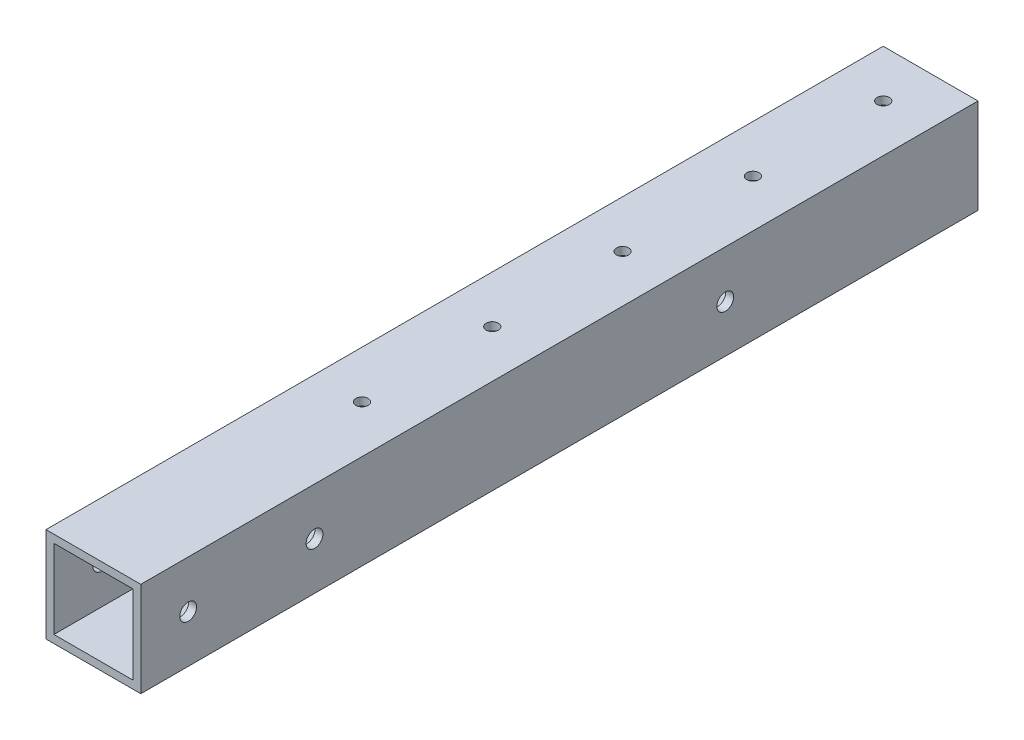
ISO-10303-21;
HEADER;
FILE_DESCRIPTION(('STEP AP214'),'2;1');
FILE_NAME('part.step','',(''),(''),'','','');
FILE_SCHEMA(('AUTOMOTIVE_DESIGN { 1 0 10303 214 1 1 1 1 }'));
ENDSEC;
DATA;
#1=APPLICATION_CONTEXT('core data for automotive mechanical design processes');
#2=APPLICATION_PROTOCOL_DEFINITION('international standard','automotive_design',2000,#1);
#3=PRODUCT_CONTEXT('',#1,'mechanical');
#4=PRODUCT('Part','Part','',(#3));
#5=PRODUCT_RELATED_PRODUCT_CATEGORY('part','',(#4));
#6=PRODUCT_DEFINITION_FORMATION('','',#4);
#7=PRODUCT_DEFINITION_CONTEXT('part definition',#1,'design');
#8=PRODUCT_DEFINITION('design','',#6,#7);
#9=PRODUCT_DEFINITION_SHAPE('','',#8);
#10=(LENGTH_UNIT() NAMED_UNIT(*) SI_UNIT(.MILLI.,.METRE.));
#11=(NAMED_UNIT(*) PLANE_ANGLE_UNIT() SI_UNIT($,.RADIAN.));
#12=(NAMED_UNIT(*) SI_UNIT($,.STERADIAN.) SOLID_ANGLE_UNIT());
#13=UNCERTAINTY_MEASURE_WITH_UNIT(LENGTH_MEASURE(1.E-05),#10,'distance_accuracy_value','');
#14=(GEOMETRIC_REPRESENTATION_CONTEXT(3) GLOBAL_UNCERTAINTY_ASSIGNED_CONTEXT((#13)) GLOBAL_UNIT_ASSIGNED_CONTEXT((#10,
#11,#12)) REPRESENTATION_CONTEXT('',''));
#15=CARTESIAN_POINT('',(0.,0.,0.));
#16=DIRECTION('',(0.,0.,1.));
#17=DIRECTION('',(1.,0.,0.));
#18=AXIS2_PLACEMENT_3D('',#15,#16,#17);
#19=CARTESIAN_POINT('',(19.05,-19.05,-171.45));
#20=DIRECTION('',(1.,0.,0.));
#21=DIRECTION('',(0.,0.,-1.));
#22=AXIS2_PLACEMENT_3D('',#19,#20,#21);
#23=PLANE('',#22);
#24=CARTESIAN_POINT('',(19.05,0.,146.05));
#25=DIRECTION('',(1.,0.,0.));
#26=DIRECTION('',(0.,0.,-1.));
#27=AXIS2_PLACEMENT_3D('',#24,#25,#26);
#28=CIRCLE('',#27,3.37819999999999);
#29=CARTESIAN_POINT('',(19.05,0.,142.6718));
#30=VERTEX_POINT('',#29);
#31=EDGE_CURVE('E283',#30,#30,#28,.T.);
#32=ORIENTED_EDGE('',*,*,#31,.F.);
#33=EDGE_LOOP('',(#32));
#34=FACE_BOUND('',#33,.T.);
#35=CARTESIAN_POINT('',(19.05,0.,-69.85));
#36=DIRECTION('',(1.,0.,0.));
#37=DIRECTION('',(0.,0.,-1.));
#38=AXIS2_PLACEMENT_3D('',#35,#36,#37);
#39=CIRCLE('',#38,3.37819999999999);
#40=CARTESIAN_POINT('',(19.05,0.,-73.2282));
#41=VERTEX_POINT('',#40);
#42=EDGE_CURVE('E293',#41,#41,#39,.T.);
#43=ORIENTED_EDGE('',*,*,#42,.F.);
#44=EDGE_LOOP('',(#43));
#45=FACE_BOUND('',#44,.T.);
#46=CARTESIAN_POINT('',(19.05,0.,95.25));
#47=DIRECTION('',(1.,0.,0.));
#48=DIRECTION('',(0.,0.,-1.));
#49=AXIS2_PLACEMENT_3D('',#46,#47,#48);
#50=CIRCLE('',#49,3.37819999999999);
#51=CARTESIAN_POINT('',(19.05,0.,91.8718));
#52=VERTEX_POINT('',#51);
#53=EDGE_CURVE('E303',#52,#52,#50,.T.);
#54=ORIENTED_EDGE('',*,*,#53,.F.);
#55=EDGE_LOOP('',(#54));
#56=FACE_BOUND('',#55,.T.);
#57=DIRECTION('',(0.,0.,1.));
#58=VECTOR('',#57,1.);
#59=CARTESIAN_POINT('',(19.05,19.05,-171.45));
#60=LINE('',#59,#58);
#61=CARTESIAN_POINT('',(19.05,19.05,-171.45));
#62=VERTEX_POINT('',#61);
#63=CARTESIAN_POINT('',(19.05,19.05,165.1));
#64=VERTEX_POINT('',#63);
#65=EDGE_CURVE('E186',#62,#64,#60,.T.);
#66=ORIENTED_EDGE('',*,*,#65,.T.);
#67=DIRECTION('',(0.,1.,0.));
#68=VECTOR('',#67,1.);
#69=CARTESIAN_POINT('',(19.05,-19.05,165.1));
#70=LINE('',#69,#68);
#71=CARTESIAN_POINT('',(19.05,-19.05,165.1));
#72=VERTEX_POINT('',#71);
#73=EDGE_CURVE('E139',#72,#64,#70,.T.);
#74=ORIENTED_EDGE('',*,*,#73,.F.);
#75=DIRECTION('',(0.,0.,1.));
#76=VECTOR('',#75,1.);
#77=CARTESIAN_POINT('',(19.05,-19.05,-171.45));
#78=LINE('',#77,#76);
#79=CARTESIAN_POINT('',(19.05,-19.05,-171.45));
#80=VERTEX_POINT('',#79);
#81=EDGE_CURVE('E11',#80,#72,#78,.T.);
#82=ORIENTED_EDGE('',*,*,#81,.F.);
#83=DIRECTION('',(0.,1.,0.));
#84=VECTOR('',#83,1.);
#85=CARTESIAN_POINT('',(19.05,-19.05,-171.45));
#86=LINE('',#85,#84);
#87=EDGE_CURVE('E167',#80,#62,#86,.T.);
#88=ORIENTED_EDGE('',*,*,#87,.T.);
#89=EDGE_LOOP('',(#66,#74,#82,#88));
#90=FACE_BOUND('',#89,.T.);
#91=ADVANCED_FACE('F35',(#34,#45,#56,#90),#23,.T.);
#92=CARTESIAN_POINT('',(-19.05,-19.05,-171.45));
#93=DIRECTION('',(0.,-1.,0.));
#94=DIRECTION('',(0.,0.,-1.));
#95=AXIS2_PLACEMENT_3D('',#92,#93,#94);
#96=PLANE('',#95);
#97=CARTESIAN_POINT('',(0.,-19.05,-152.4));
#98=DIRECTION('',(0.,1.,0.));
#99=DIRECTION('',(0.,0.,1.));
#100=AXIS2_PLACEMENT_3D('',#97,#98,#99);
#101=CIRCLE('',#100,2.45744999999998);
#102=CARTESIAN_POINT('',(0.,-19.05,-149.94255));
#103=VERTEX_POINT('',#102);
#104=EDGE_CURVE('E530',#103,#103,#101,.T.);
#105=ORIENTED_EDGE('',*,*,#104,.T.);
#106=EDGE_LOOP('',(#105));
#107=FACE_BOUND('',#106,.T.);
#108=CARTESIAN_POINT('',(1.45716771982052E-13,-19.05,-100.0125));
#109=DIRECTION('',(0.,1.,0.));
#110=DIRECTION('',(0.,0.,1.));
#111=AXIS2_PLACEMENT_3D('',#108,#109,#110);
#112=CIRCLE('',#111,2.45744999999998);
#113=CARTESIAN_POINT('',(1.45716771982052E-13,-19.05,-97.55505));
#114=VERTEX_POINT('',#113);
#115=EDGE_CURVE('E233',#114,#114,#112,.T.);
#116=ORIENTED_EDGE('',*,*,#115,.T.);
#117=EDGE_LOOP('',(#116));
#118=FACE_BOUND('',#117,.T.);
#119=CARTESIAN_POINT('',(0.,-19.05,-47.6249999999998));
#120=DIRECTION('',(0.,1.,0.));
#121=DIRECTION('',(0.,0.,1.));
#122=AXIS2_PLACEMENT_3D('',#119,#120,#121);
#123=CIRCLE('',#122,2.45744999999998);
#124=CARTESIAN_POINT('',(0.,-19.05,-45.1675499999998));
#125=VERTEX_POINT('',#124);
#126=EDGE_CURVE('E228',#125,#125,#123,.T.);
#127=ORIENTED_EDGE('',*,*,#126,.T.);
#128=EDGE_LOOP('',(#127));
#129=FACE_BOUND('',#128,.T.);
#130=CARTESIAN_POINT('',(1.31838984174237E-13,-19.05,4.76249999999998));
#131=DIRECTION('',(0.,1.,0.));
#132=DIRECTION('',(0.,0.,1.));
#133=AXIS2_PLACEMENT_3D('',#130,#131,#132);
#134=CIRCLE('',#133,2.45744999999998);
#135=CARTESIAN_POINT('',(1.31838984174237E-13,-19.05,7.21994999999996));
#136=VERTEX_POINT('',#135);
#137=EDGE_CURVE('E223',#136,#136,#134,.T.);
#138=ORIENTED_EDGE('',*,*,#137,.T.);
#139=EDGE_LOOP('',(#138));
#140=FACE_BOUND('',#139,.T.);
#141=CARTESIAN_POINT('',(0.,-19.05,57.15));
#142=DIRECTION('',(0.,1.,0.));
#143=DIRECTION('',(0.,0.,1.));
#144=AXIS2_PLACEMENT_3D('',#141,#142,#143);
#145=CIRCLE('',#144,2.45744999999998);
#146=CARTESIAN_POINT('',(0.,-19.05,59.60745));
#147=VERTEX_POINT('',#146);
#148=EDGE_CURVE('E217',#147,#147,#145,.T.);
#149=ORIENTED_EDGE('',*,*,#148,.T.);
#150=EDGE_LOOP('',(#149));
#151=FACE_BOUND('',#150,.T.);
#152=ORIENTED_EDGE('',*,*,#81,.T.);
#153=DIRECTION('',(1.,0.,0.));
#154=VECTOR('',#153,1.);
#155=CARTESIAN_POINT('',(-19.05,-19.05,165.1));
#156=LINE('',#155,#154);
#157=CARTESIAN_POINT('',(-19.05,-19.05,165.1));
#158=VERTEX_POINT('',#157);
#159=EDGE_CURVE('E151',#158,#72,#156,.T.);
#160=ORIENTED_EDGE('',*,*,#159,.F.);
#161=DIRECTION('',(0.,0.,1.));
#162=VECTOR('',#161,1.);
#163=CARTESIAN_POINT('',(-19.05,-19.05,-171.45));
#164=LINE('',#163,#162);
#165=CARTESIAN_POINT('',(-19.05,-19.05,-171.45));
#166=VERTEX_POINT('',#165);
#167=EDGE_CURVE('E44',#166,#158,#164,.T.);
#168=ORIENTED_EDGE('',*,*,#167,.F.);
#169=DIRECTION('',(1.,0.,0.));
#170=VECTOR('',#169,1.);
#171=CARTESIAN_POINT('',(-19.05,-19.05,-171.45));
#172=LINE('',#171,#170);
#173=EDGE_CURVE('E183',#166,#80,#172,.T.);
#174=ORIENTED_EDGE('',*,*,#173,.T.);
#175=EDGE_LOOP('',(#152,#160,#168,#174));
#176=FACE_BOUND('',#175,.T.);
#177=ADVANCED_FACE('F331',(#107,#118,#129,#140,#151,#176),#96,.T.);
#178=CARTESIAN_POINT('',(-19.05,-19.05,-171.45));
#179=DIRECTION('',(-1.,0.,0.));
#180=DIRECTION('',(0.,0.,1.));
#181=AXIS2_PLACEMENT_3D('',#178,#179,#180);
#182=PLANE('',#181);
#183=CARTESIAN_POINT('',(-19.05,0.,146.05));
#184=DIRECTION('',(1.,0.,0.));
#185=DIRECTION('',(0.,0.,-1.));
#186=AXIS2_PLACEMENT_3D('',#183,#184,#185);
#187=CIRCLE('',#186,3.37819999999999);
#188=CARTESIAN_POINT('',(-19.05,0.,142.6718));
#189=VERTEX_POINT('',#188);
#190=EDGE_CURVE('E211',#189,#189,#187,.T.);
#191=ORIENTED_EDGE('',*,*,#190,.T.);
#192=EDGE_LOOP('',(#191));
#193=FACE_BOUND('',#192,.T.);
#194=CARTESIAN_POINT('',(-19.05,0.,-69.85));
#195=DIRECTION('',(1.,0.,0.));
#196=DIRECTION('',(0.,0.,-1.));
#197=AXIS2_PLACEMENT_3D('',#194,#195,#196);
#198=CIRCLE('',#197,3.37819999999999);
#199=CARTESIAN_POINT('',(-19.05,0.,-73.2282));
#200=VERTEX_POINT('',#199);
#201=EDGE_CURVE('E205',#200,#200,#198,.T.);
#202=ORIENTED_EDGE('',*,*,#201,.T.);
#203=EDGE_LOOP('',(#202));
#204=FACE_BOUND('',#203,.T.);
#205=CARTESIAN_POINT('',(-19.05,0.,95.25));
#206=DIRECTION('',(1.,0.,0.));
#207=DIRECTION('',(0.,0.,-1.));
#208=AXIS2_PLACEMENT_3D('',#205,#206,#207);
#209=CIRCLE('',#208,3.37819999999999);
#210=CARTESIAN_POINT('',(-19.05,0.,91.8718));
#211=VERTEX_POINT('',#210);
#212=EDGE_CURVE('E199',#211,#211,#209,.T.);
#213=ORIENTED_EDGE('',*,*,#212,.T.);
#214=EDGE_LOOP('',(#213));
#215=FACE_BOUND('',#214,.T.);
#216=ORIENTED_EDGE('',*,*,#167,.T.);
#217=DIRECTION('',(0.,-1.,0.));
#218=VECTOR('',#217,1.);
#219=CARTESIAN_POINT('',(-19.05,-19.05,165.1));
#220=LINE('',#219,#218);
#221=CARTESIAN_POINT('',(-19.05,19.05,165.1));
#222=VERTEX_POINT('',#221);
#223=EDGE_CURVE('E147',#222,#158,#220,.T.);
#224=ORIENTED_EDGE('',*,*,#223,.F.);
#225=DIRECTION('',(0.,0.,1.));
#226=VECTOR('',#225,1.);
#227=CARTESIAN_POINT('',(-19.05,19.05,-171.45));
#228=LINE('',#227,#226);
#229=CARTESIAN_POINT('',(-19.05,19.05,-171.45));
#230=VERTEX_POINT('',#229);
#231=EDGE_CURVE('E190',#230,#222,#228,.T.);
#232=ORIENTED_EDGE('',*,*,#231,.F.);
#233=DIRECTION('',(0.,-1.,0.));
#234=VECTOR('',#233,1.);
#235=CARTESIAN_POINT('',(-19.05,-19.05,-171.45));
#236=LINE('',#235,#234);
#237=EDGE_CURVE('E179',#230,#166,#236,.T.);
#238=ORIENTED_EDGE('',*,*,#237,.T.);
#239=EDGE_LOOP('',(#216,#224,#232,#238));
#240=FACE_BOUND('',#239,.T.);
#241=ADVANCED_FACE('F336',(#193,#204,#215,#240),#182,.T.);
#242=CARTESIAN_POINT('',(-19.05,19.05,-171.45));
#243=DIRECTION('',(0.,1.,0.));
#244=DIRECTION('',(0.,0.,1.));
#245=AXIS2_PLACEMENT_3D('',#242,#243,#244);
#246=PLANE('',#245);
#247=CARTESIAN_POINT('',(0.,19.05,-152.4));
#248=DIRECTION('',(0.,1.,0.));
#249=DIRECTION('',(0.,0.,1.));
#250=AXIS2_PLACEMENT_3D('',#247,#248,#249);
#251=CIRCLE('',#250,2.45744999999999);
#252=CARTESIAN_POINT('',(0.,19.05,-149.94255));
#253=VERTEX_POINT('',#252);
#254=EDGE_CURVE('E540',#253,#253,#251,.T.);
#255=ORIENTED_EDGE('',*,*,#254,.F.);
#256=EDGE_LOOP('',(#255));
#257=FACE_BOUND('',#256,.T.);
#258=CARTESIAN_POINT('',(1.45716771982052E-13,19.05,-100.0125));
#259=DIRECTION('',(0.,1.,0.));
#260=DIRECTION('',(0.,0.,1.));
#261=AXIS2_PLACEMENT_3D('',#258,#259,#260);
#262=CIRCLE('',#261,2.45744999999999);
#263=CARTESIAN_POINT('',(1.45716771982052E-13,19.05,-97.55505));
#264=VERTEX_POINT('',#263);
#265=EDGE_CURVE('E243',#264,#264,#262,.T.);
#266=ORIENTED_EDGE('',*,*,#265,.F.);
#267=EDGE_LOOP('',(#266));
#268=FACE_BOUND('',#267,.T.);
#269=CARTESIAN_POINT('',(0.,19.05,-47.6249999999998));
#270=DIRECTION('',(0.,1.,0.));
#271=DIRECTION('',(0.,0.,1.));
#272=AXIS2_PLACEMENT_3D('',#269,#270,#271);
#273=CIRCLE('',#272,2.45744999999999);
#274=CARTESIAN_POINT('',(0.,19.05,-45.1675499999998));
#275=VERTEX_POINT('',#274);
#276=EDGE_CURVE('E240',#275,#275,#273,.T.);
#277=ORIENTED_EDGE('',*,*,#276,.F.);
#278=EDGE_LOOP('',(#277));
#279=FACE_BOUND('',#278,.T.);
#280=CARTESIAN_POINT('',(1.31838984174237E-13,19.05,4.76249999999998));
#281=DIRECTION('',(0.,1.,0.));
#282=DIRECTION('',(0.,0.,1.));
#283=AXIS2_PLACEMENT_3D('',#280,#281,#282);
#284=CIRCLE('',#283,2.45744999999999);
#285=CARTESIAN_POINT('',(1.31838984174237E-13,19.05,7.21994999999996));
#286=VERTEX_POINT('',#285);
#287=EDGE_CURVE('E263',#286,#286,#284,.T.);
#288=ORIENTED_EDGE('',*,*,#287,.F.);
#289=EDGE_LOOP('',(#288));
#290=FACE_BOUND('',#289,.T.);
#291=CARTESIAN_POINT('',(0.,19.05,57.15));
#292=DIRECTION('',(0.,1.,0.));
#293=DIRECTION('',(0.,0.,1.));
#294=AXIS2_PLACEMENT_3D('',#291,#292,#293);
#295=CIRCLE('',#294,2.45744999999999);
#296=CARTESIAN_POINT('',(0.,19.05,59.60745));
#297=VERTEX_POINT('',#296);
#298=EDGE_CURVE('E273',#297,#297,#295,.T.);
#299=ORIENTED_EDGE('',*,*,#298,.F.);
#300=EDGE_LOOP('',(#299));
#301=FACE_BOUND('',#300,.T.);
#302=ORIENTED_EDGE('',*,*,#231,.T.);
#303=DIRECTION('',(-1.,0.,0.));
#304=VECTOR('',#303,1.);
#305=CARTESIAN_POINT('',(-19.05,19.05,165.1));
#306=LINE('',#305,#304);
#307=EDGE_CURVE('E143',#64,#222,#306,.T.);
#308=ORIENTED_EDGE('',*,*,#307,.F.);
#309=ORIENTED_EDGE('',*,*,#65,.F.);
#310=DIRECTION('',(-1.,0.,0.));
#311=VECTOR('',#310,1.);
#312=CARTESIAN_POINT('',(-19.05,19.05,-171.45));
#313=LINE('',#312,#311);
#314=EDGE_CURVE('E175',#62,#230,#313,.T.);
#315=ORIENTED_EDGE('',*,*,#314,.T.);
#316=EDGE_LOOP('',(#302,#308,#309,#315));
#317=FACE_BOUND('',#316,.T.);
#318=ADVANCED_FACE('F347',(#257,#268,#279,#290,#301,#317),#246,.T.);
#319=CARTESIAN_POINT('',(0.,0.,-171.45));
#320=DIRECTION('',(0.,0.,-1.));
#321=DIRECTION('',(-1.,0.,0.));
#322=AXIS2_PLACEMENT_3D('',#319,#320,#321);
#323=PLANE('',#322);
#324=DIRECTION('',(0.,1.,0.));
#325=VECTOR('',#324,1.);
#326=CARTESIAN_POINT('',(15.875,-15.875,-171.45));
#327=LINE('',#326,#325);
#328=CARTESIAN_POINT('',(15.875,-15.875,-171.45));
#329=VERTEX_POINT('',#328);
#330=CARTESIAN_POINT('',(15.875,15.875,-171.45));
#331=VERTEX_POINT('',#330);
#332=EDGE_CURVE('E155',#329,#331,#327,.T.);
#333=ORIENTED_EDGE('',*,*,#332,.T.);
#334=DIRECTION('',(-1.,0.,0.));
#335=VECTOR('',#334,1.);
#336=CARTESIAN_POINT('',(-15.875,15.875,-171.45));
#337=LINE('',#336,#335);
#338=CARTESIAN_POINT('',(-15.875,15.875,-171.45));
#339=VERTEX_POINT('',#338);
#340=EDGE_CURVE('E108',#331,#339,#337,.T.);
#341=ORIENTED_EDGE('',*,*,#340,.T.);
#342=DIRECTION('',(0.,-1.,0.));
#343=VECTOR('',#342,1.);
#344=CARTESIAN_POINT('',(-15.875,-15.875,-171.45));
#345=LINE('',#344,#343);
#346=CARTESIAN_POINT('',(-15.875,-15.875,-171.45));
#347=VERTEX_POINT('',#346);
#348=EDGE_CURVE('E52',#339,#347,#345,.T.);
#349=ORIENTED_EDGE('',*,*,#348,.T.);
#350=DIRECTION('',(1.,0.,0.));
#351=VECTOR('',#350,1.);
#352=CARTESIAN_POINT('',(-15.875,-15.875,-171.45));
#353=LINE('',#352,#351);
#354=EDGE_CURVE('E114',#347,#329,#353,.T.);
#355=ORIENTED_EDGE('',*,*,#354,.T.);
#356=EDGE_LOOP('',(#333,#341,#349,#355));
#357=FACE_BOUND('',#356,.T.);
#358=ORIENTED_EDGE('',*,*,#87,.F.);
#359=ORIENTED_EDGE('',*,*,#173,.F.);
#360=ORIENTED_EDGE('',*,*,#237,.F.);
#361=ORIENTED_EDGE('',*,*,#314,.F.);
#362=EDGE_LOOP('',(#358,#359,#360,#361));
#363=FACE_BOUND('',#362,.T.);
#364=ADVANCED_FACE('F355',(#357,#363),#323,.T.);
#365=CARTESIAN_POINT('',(15.875,-15.875,-171.45));
#366=DIRECTION('',(1.,0.,0.));
#367=DIRECTION('',(0.,0.,-1.));
#368=AXIS2_PLACEMENT_3D('',#365,#366,#367);
#369=PLANE('',#368);
#370=CARTESIAN_POINT('',(15.875,0.,146.05));
#371=DIRECTION('',(1.,0.,0.));
#372=DIRECTION('',(0.,0.,-1.));
#373=AXIS2_PLACEMENT_3D('',#370,#371,#372);
#374=CIRCLE('',#373,3.37819999999999);
#375=CARTESIAN_POINT('',(15.875,0.,142.6718));
#376=VERTEX_POINT('',#375);
#377=EDGE_CURVE('E210',#376,#376,#374,.T.);
#378=ORIENTED_EDGE('',*,*,#377,.T.);
#379=EDGE_LOOP('',(#378));
#380=FACE_BOUND('',#379,.T.);
#381=CARTESIAN_POINT('',(15.875,0.,-69.85));
#382=DIRECTION('',(1.,0.,0.));
#383=DIRECTION('',(0.,0.,-1.));
#384=AXIS2_PLACEMENT_3D('',#381,#382,#383);
#385=CIRCLE('',#384,3.37819999999999);
#386=CARTESIAN_POINT('',(15.875,0.,-73.2282));
#387=VERTEX_POINT('',#386);
#388=EDGE_CURVE('E200',#387,#387,#385,.T.);
#389=ORIENTED_EDGE('',*,*,#388,.T.);
#390=EDGE_LOOP('',(#389));
#391=FACE_BOUND('',#390,.T.);
#392=CARTESIAN_POINT('',(15.875,0.,95.25));
#393=DIRECTION('',(1.,0.,0.));
#394=DIRECTION('',(0.,0.,-1.));
#395=AXIS2_PLACEMENT_3D('',#392,#393,#394);
#396=CIRCLE('',#395,3.37819999999999);
#397=CARTESIAN_POINT('',(15.875,0.,91.8718));
#398=VERTEX_POINT('',#397);
#399=EDGE_CURVE('E124',#398,#398,#396,.T.);
#400=ORIENTED_EDGE('',*,*,#399,.T.);
#401=EDGE_LOOP('',(#400));
#402=FACE_BOUND('',#401,.T.);
#403=DIRECTION('',(0.,0.,1.));
#404=VECTOR('',#403,1.);
#405=CARTESIAN_POINT('',(15.875,-15.875,-171.45));
#406=LINE('',#405,#404);
#407=CARTESIAN_POINT('',(15.875,-15.875,165.1));
#408=VERTEX_POINT('',#407);
#409=EDGE_CURVE('E119',#329,#408,#406,.T.);
#410=ORIENTED_EDGE('',*,*,#409,.T.);
#411=DIRECTION('',(0.,1.,0.));
#412=VECTOR('',#411,1.);
#413=CARTESIAN_POINT('',(15.875,-15.875,165.1));
#414=LINE('',#413,#412);
#415=CARTESIAN_POINT('',(15.875,15.875,165.1));
#416=VERTEX_POINT('',#415);
#417=EDGE_CURVE('E117',#408,#416,#414,.T.);
#418=ORIENTED_EDGE('',*,*,#417,.T.);
#419=DIRECTION('',(0.,0.,1.));
#420=VECTOR('',#419,1.);
#421=CARTESIAN_POINT('',(15.875,15.875,-171.45));
#422=LINE('',#421,#420);
#423=EDGE_CURVE('E101',#331,#416,#422,.T.);
#424=ORIENTED_EDGE('',*,*,#423,.F.);
#425=ORIENTED_EDGE('',*,*,#332,.F.);
#426=EDGE_LOOP('',(#410,#418,#424,#425));
#427=FACE_BOUND('',#426,.T.);
#428=ADVANCED_FACE('F118',(#380,#391,#402,#427),#369,.F.);
#429=CARTESIAN_POINT('',(-15.875,-15.875,-171.45));
#430=DIRECTION('',(0.,-1.,0.));
#431=DIRECTION('',(0.,0.,-1.));
#432=AXIS2_PLACEMENT_3D('',#429,#430,#431);
#433=PLANE('',#432);
#434=CARTESIAN_POINT('',(0.,-15.875,-152.4));
#435=DIRECTION('',(0.,-1.,0.));
#436=DIRECTION('',(0.,0.,-1.));
#437=AXIS2_PLACEMENT_3D('',#434,#435,#436);
#438=CIRCLE('',#437,2.45744999999999);
#439=CARTESIAN_POINT('',(0.,-15.875,-154.85745));
#440=VERTEX_POINT('',#439);
#441=EDGE_CURVE('E250',#440,#440,#438,.T.);
#442=ORIENTED_EDGE('',*,*,#441,.T.);
#443=EDGE_LOOP('',(#442));
#444=FACE_BOUND('',#443,.T.);
#445=CARTESIAN_POINT('',(1.45716771982052E-13,-15.875,-100.0125));
#446=DIRECTION('',(0.,-1.,0.));
#447=DIRECTION('',(0.,0.,-1.));
#448=AXIS2_PLACEMENT_3D('',#445,#446,#447);
#449=CIRCLE('',#448,2.45744999999999);
#450=CARTESIAN_POINT('',(1.45716771982052E-13,-15.875,-102.46995));
#451=VERTEX_POINT('',#450);
#452=EDGE_CURVE('E232',#451,#451,#449,.T.);
#453=ORIENTED_EDGE('',*,*,#452,.T.);
#454=EDGE_LOOP('',(#453));
#455=FACE_BOUND('',#454,.T.);
#456=CARTESIAN_POINT('',(0.,-15.875,-47.6249999999998));
#457=DIRECTION('',(0.,-1.,0.));
#458=DIRECTION('',(0.,0.,-1.));
#459=AXIS2_PLACEMENT_3D('',#456,#457,#458);
#460=CIRCLE('',#459,2.45744999999999);
#461=CARTESIAN_POINT('',(0.,-15.875,-50.0824499999998));
#462=VERTEX_POINT('',#461);
#463=EDGE_CURVE('E227',#462,#462,#460,.T.);
#464=ORIENTED_EDGE('',*,*,#463,.T.);
#465=EDGE_LOOP('',(#464));
#466=FACE_BOUND('',#465,.T.);
#467=CARTESIAN_POINT('',(1.31838984174237E-13,-15.875,4.76249999999998));
#468=DIRECTION('',(0.,-1.,0.));
#469=DIRECTION('',(0.,0.,-1.));
#470=AXIS2_PLACEMENT_3D('',#467,#468,#469);
#471=CIRCLE('',#470,2.45744999999999);
#472=CARTESIAN_POINT('',(1.31838984174237E-13,-15.875,2.30504999999999));
#473=VERTEX_POINT('',#472);
#474=EDGE_CURVE('E222',#473,#473,#471,.T.);
#475=ORIENTED_EDGE('',*,*,#474,.T.);
#476=EDGE_LOOP('',(#475));
#477=FACE_BOUND('',#476,.T.);
#478=CARTESIAN_POINT('',(0.,-15.875,57.15));
#479=DIRECTION('',(0.,-1.,0.));
#480=DIRECTION('',(0.,0.,-1.));
#481=AXIS2_PLACEMENT_3D('',#478,#479,#480);
#482=CIRCLE('',#481,2.45744999999999);
#483=CARTESIAN_POINT('',(0.,-15.875,54.69255));
#484=VERTEX_POINT('',#483);
#485=EDGE_CURVE('E216',#484,#484,#482,.T.);
#486=ORIENTED_EDGE('',*,*,#485,.T.);
#487=EDGE_LOOP('',(#486));
#488=FACE_BOUND('',#487,.T.);
#489=DIRECTION('',(0.,0.,1.));
#490=VECTOR('',#489,1.);
#491=CARTESIAN_POINT('',(-15.875,-15.875,-171.45));
#492=LINE('',#491,#490);
#493=CARTESIAN_POINT('',(-15.875,-15.875,165.1));
#494=VERTEX_POINT('',#493);
#495=EDGE_CURVE('E168',#347,#494,#492,.T.);
#496=ORIENTED_EDGE('',*,*,#495,.T.);
#497=DIRECTION('',(1.,0.,0.));
#498=VECTOR('',#497,1.);
#499=CARTESIAN_POINT('',(-15.875,-15.875,165.1));
#500=LINE('',#499,#498);
#501=EDGE_CURVE('E133',#494,#408,#500,.T.);
#502=ORIENTED_EDGE('',*,*,#501,.T.);
#503=ORIENTED_EDGE('',*,*,#409,.F.);
#504=ORIENTED_EDGE('',*,*,#354,.F.);
#505=EDGE_LOOP('',(#496,#502,#503,#504));
#506=FACE_BOUND('',#505,.T.);
#507=ADVANCED_FACE('F371',(#444,#455,#466,#477,#488,#506),#433,.F.);
#508=CARTESIAN_POINT('',(-15.875,-15.875,-171.45));
#509=DIRECTION('',(-1.,0.,0.));
#510=DIRECTION('',(0.,0.,1.));
#511=AXIS2_PLACEMENT_3D('',#508,#509,#510);
#512=PLANE('',#511);
#513=CARTESIAN_POINT('',(-15.875,0.,146.05));
#514=DIRECTION('',(-1.,0.,0.));
#515=DIRECTION('',(0.,0.,1.));
#516=AXIS2_PLACEMENT_3D('',#513,#514,#515);
#517=CIRCLE('',#516,3.37819999999999);
#518=CARTESIAN_POINT('',(-15.875,0.,149.4282));
#519=VERTEX_POINT('',#518);
#520=EDGE_CURVE('E206',#519,#519,#517,.T.);
#521=ORIENTED_EDGE('',*,*,#520,.T.);
#522=EDGE_LOOP('',(#521));
#523=FACE_BOUND('',#522,.T.);
#524=CARTESIAN_POINT('',(-15.875,0.,-69.85));
#525=DIRECTION('',(-1.,0.,0.));
#526=DIRECTION('',(0.,0.,1.));
#527=AXIS2_PLACEMENT_3D('',#524,#525,#526);
#528=CIRCLE('',#527,3.37819999999999);
#529=CARTESIAN_POINT('',(-15.875,0.,-66.4718));
#530=VERTEX_POINT('',#529);
#531=EDGE_CURVE('E204',#530,#530,#528,.T.);
#532=ORIENTED_EDGE('',*,*,#531,.T.);
#533=EDGE_LOOP('',(#532));
#534=FACE_BOUND('',#533,.T.);
#535=CARTESIAN_POINT('',(-15.875,0.,95.25));
#536=DIRECTION('',(-1.,0.,0.));
#537=DIRECTION('',(0.,0.,1.));
#538=AXIS2_PLACEMENT_3D('',#535,#536,#537);
#539=CIRCLE('',#538,3.37819999999999);
#540=CARTESIAN_POINT('',(-15.875,0.,98.6282));
#541=VERTEX_POINT('',#540);
#542=EDGE_CURVE('E195',#541,#541,#539,.T.);
#543=ORIENTED_EDGE('',*,*,#542,.T.);
#544=EDGE_LOOP('',(#543));
#545=FACE_BOUND('',#544,.T.);
#546=DIRECTION('',(0.,0.,1.));
#547=VECTOR('',#546,1.);
#548=CARTESIAN_POINT('',(-15.875,15.875,-171.45));
#549=LINE('',#548,#547);
#550=CARTESIAN_POINT('',(-15.875,15.875,165.1));
#551=VERTEX_POINT('',#550);
#552=EDGE_CURVE('E113',#339,#551,#549,.T.);
#553=ORIENTED_EDGE('',*,*,#552,.T.);
#554=DIRECTION('',(0.,-1.,0.));
#555=VECTOR('',#554,1.);
#556=CARTESIAN_POINT('',(-15.875,-15.875,165.1));
#557=LINE('',#556,#555);
#558=EDGE_CURVE('E128',#551,#494,#557,.T.);
#559=ORIENTED_EDGE('',*,*,#558,.T.);
#560=ORIENTED_EDGE('',*,*,#495,.F.);
#561=ORIENTED_EDGE('',*,*,#348,.F.);
#562=EDGE_LOOP('',(#553,#559,#560,#561));
#563=FACE_BOUND('',#562,.T.);
#564=ADVANCED_FACE('F375',(#523,#534,#545,#563),#512,.F.);
#565=CARTESIAN_POINT('',(-15.875,15.875,-171.45));
#566=DIRECTION('',(0.,1.,0.));
#567=DIRECTION('',(0.,0.,1.));
#568=AXIS2_PLACEMENT_3D('',#565,#566,#567);
#569=PLANE('',#568);
#570=CARTESIAN_POINT('',(0.,15.875,-152.4));
#571=DIRECTION('',(0.,1.,0.));
#572=DIRECTION('',(0.,0.,1.));
#573=AXIS2_PLACEMENT_3D('',#570,#571,#572);
#574=CIRCLE('',#573,2.45744999999999);
#575=CARTESIAN_POINT('',(0.,15.875,-149.94255));
#576=VERTEX_POINT('',#575);
#577=EDGE_CURVE('E38',#576,#576,#574,.T.);
#578=ORIENTED_EDGE('',*,*,#577,.T.);
#579=EDGE_LOOP('',(#578));
#580=FACE_BOUND('',#579,.T.);
#581=CARTESIAN_POINT('',(1.45716771982052E-13,15.875,-100.0125));
#582=DIRECTION('',(0.,1.,0.));
#583=DIRECTION('',(0.,0.,1.));
#584=AXIS2_PLACEMENT_3D('',#581,#582,#583);
#585=CIRCLE('',#584,2.45744999999999);
#586=CARTESIAN_POINT('',(1.45716771982052E-13,15.875,-97.55505));
#587=VERTEX_POINT('',#586);
#588=EDGE_CURVE('E229',#587,#587,#585,.T.);
#589=ORIENTED_EDGE('',*,*,#588,.T.);
#590=EDGE_LOOP('',(#589));
#591=FACE_BOUND('',#590,.T.);
#592=CARTESIAN_POINT('',(0.,15.875,-47.6249999999998));
#593=DIRECTION('',(0.,1.,0.));
#594=DIRECTION('',(0.,0.,1.));
#595=AXIS2_PLACEMENT_3D('',#592,#593,#594);
#596=CIRCLE('',#595,2.45744999999999);
#597=CARTESIAN_POINT('',(0.,15.875,-45.1675499999998));
#598=VERTEX_POINT('',#597);
#599=EDGE_CURVE('E224',#598,#598,#596,.T.);
#600=ORIENTED_EDGE('',*,*,#599,.T.);
#601=EDGE_LOOP('',(#600));
#602=FACE_BOUND('',#601,.T.);
#603=CARTESIAN_POINT('',(1.31838984174237E-13,15.875,4.76249999999998));
#604=DIRECTION('',(0.,1.,0.));
#605=DIRECTION('',(0.,0.,1.));
#606=AXIS2_PLACEMENT_3D('',#603,#604,#605);
#607=CIRCLE('',#606,2.45744999999999);
#608=CARTESIAN_POINT('',(1.31838984174237E-13,15.875,7.21994999999996));
#609=VERTEX_POINT('',#608);
#610=EDGE_CURVE('E218',#609,#609,#607,.T.);
#611=ORIENTED_EDGE('',*,*,#610,.T.);
#612=EDGE_LOOP('',(#611));
#613=FACE_BOUND('',#612,.T.);
#614=CARTESIAN_POINT('',(0.,15.875,57.15));
#615=DIRECTION('',(0.,1.,0.));
#616=DIRECTION('',(0.,0.,1.));
#617=AXIS2_PLACEMENT_3D('',#614,#615,#616);
#618=CIRCLE('',#617,2.45744999999999);
#619=CARTESIAN_POINT('',(0.,15.875,59.60745));
#620=VERTEX_POINT('',#619);
#621=EDGE_CURVE('E212',#620,#620,#618,.T.);
#622=ORIENTED_EDGE('',*,*,#621,.T.);
#623=EDGE_LOOP('',(#622));
#624=FACE_BOUND('',#623,.T.);
#625=ORIENTED_EDGE('',*,*,#423,.T.);
#626=DIRECTION('',(-1.,0.,0.));
#627=VECTOR('',#626,1.);
#628=CARTESIAN_POINT('',(-15.875,15.875,165.1));
#629=LINE('',#628,#627);
#630=EDGE_CURVE('E105',#416,#551,#629,.T.);
#631=ORIENTED_EDGE('',*,*,#630,.T.);
#632=ORIENTED_EDGE('',*,*,#552,.F.);
#633=ORIENTED_EDGE('',*,*,#340,.F.);
#634=EDGE_LOOP('',(#625,#631,#632,#633));
#635=FACE_BOUND('',#634,.T.);
#636=ADVANCED_FACE('F103',(#580,#591,#602,#613,#624,#635),#569,.F.);
#637=CARTESIAN_POINT('',(0.,0.,165.1));
#638=DIRECTION('',(0.,0.,-1.));
#639=DIRECTION('',(-1.,0.,0.));
#640=AXIS2_PLACEMENT_3D('',#637,#638,#639);
#641=PLANE('',#640);
#642=ORIENTED_EDGE('',*,*,#73,.T.);
#643=ORIENTED_EDGE('',*,*,#307,.T.);
#644=ORIENTED_EDGE('',*,*,#223,.T.);
#645=ORIENTED_EDGE('',*,*,#159,.T.);
#646=EDGE_LOOP('',(#642,#643,#644,#645));
#647=FACE_BOUND('',#646,.T.);
#648=ORIENTED_EDGE('',*,*,#417,.F.);
#649=ORIENTED_EDGE('',*,*,#501,.F.);
#650=ORIENTED_EDGE('',*,*,#558,.F.);
#651=ORIENTED_EDGE('',*,*,#630,.F.);
#652=EDGE_LOOP('',(#648,#649,#650,#651));
#653=FACE_BOUND('',#652,.T.);
#654=ADVANCED_FACE('F126',(#647,#653),#641,.F.);
#655=CARTESIAN_POINT('',(19.05,0.,95.25));
#656=DIRECTION('',(1.,0.,0.));
#657=DIRECTION('',(0.,0.,-1.));
#658=AXIS2_PLACEMENT_3D('',#655,#656,#657);
#659=CYLINDRICAL_SURFACE('',#658,3.37819999999999);
#660=ORIENTED_EDGE('',*,*,#212,.F.);
#661=EDGE_LOOP('',(#660));
#662=FACE_BOUND('',#661,.T.);
#663=ORIENTED_EDGE('',*,*,#542,.F.);
#664=EDGE_LOOP('',(#663));
#665=FACE_BOUND('',#664,.T.);
#666=ADVANCED_FACE('F318',(#662,#665),#659,.F.);
#667=ORIENTED_EDGE('',*,*,#53,.T.);
#668=EDGE_LOOP('',(#667));
#669=FACE_BOUND('',#668,.T.);
#670=ORIENTED_EDGE('',*,*,#399,.F.);
#671=EDGE_LOOP('',(#670));
#672=FACE_BOUND('',#671,.T.);
#673=ADVANCED_FACE('F315',(#669,#672),#659,.F.);
#674=CARTESIAN_POINT('',(19.05,0.,-69.85));
#675=DIRECTION('',(1.,0.,0.));
#676=DIRECTION('',(0.,0.,-1.));
#677=AXIS2_PLACEMENT_3D('',#674,#675,#676);
#678=CYLINDRICAL_SURFACE('',#677,3.37819999999999);
#679=ORIENTED_EDGE('',*,*,#42,.T.);
#680=EDGE_LOOP('',(#679));
#681=FACE_BOUND('',#680,.T.);
#682=ORIENTED_EDGE('',*,*,#388,.F.);
#683=EDGE_LOOP('',(#682));
#684=FACE_BOUND('',#683,.T.);
#685=ADVANCED_FACE('F317',(#681,#684),#678,.F.);
#686=ORIENTED_EDGE('',*,*,#201,.F.);
#687=EDGE_LOOP('',(#686));
#688=FACE_BOUND('',#687,.T.);
#689=ORIENTED_EDGE('',*,*,#531,.F.);
#690=EDGE_LOOP('',(#689));
#691=FACE_BOUND('',#690,.T.);
#692=ADVANCED_FACE('F325',(#688,#691),#678,.F.);
#693=CARTESIAN_POINT('',(19.05,0.,146.05));
#694=DIRECTION('',(1.,0.,0.));
#695=DIRECTION('',(0.,0.,-1.));
#696=AXIS2_PLACEMENT_3D('',#693,#694,#695);
#697=CYLINDRICAL_SURFACE('',#696,3.37819999999999);
#698=ORIENTED_EDGE('',*,*,#190,.F.);
#699=EDGE_LOOP('',(#698));
#700=FACE_BOUND('',#699,.T.);
#701=ORIENTED_EDGE('',*,*,#520,.F.);
#702=EDGE_LOOP('',(#701));
#703=FACE_BOUND('',#702,.T.);
#704=ADVANCED_FACE('F410',(#700,#703),#697,.F.);
#705=ORIENTED_EDGE('',*,*,#31,.T.);
#706=EDGE_LOOP('',(#705));
#707=FACE_BOUND('',#706,.T.);
#708=ORIENTED_EDGE('',*,*,#377,.F.);
#709=EDGE_LOOP('',(#708));
#710=FACE_BOUND('',#709,.T.);
#711=ADVANCED_FACE('F419',(#707,#710),#697,.F.);
#712=CARTESIAN_POINT('',(0.,19.05,57.15));
#713=DIRECTION('',(0.,1.,0.));
#714=DIRECTION('',(0.,0.,1.));
#715=AXIS2_PLACEMENT_3D('',#712,#713,#714);
#716=CYLINDRICAL_SURFACE('',#715,2.45744999999999);
#717=ORIENTED_EDGE('',*,*,#298,.T.);
#718=EDGE_LOOP('',(#717));
#719=FACE_BOUND('',#718,.T.);
#720=ORIENTED_EDGE('',*,*,#621,.F.);
#721=EDGE_LOOP('',(#720));
#722=FACE_BOUND('',#721,.T.);
#723=ADVANCED_FACE('F429',(#719,#722),#716,.F.);
#724=ORIENTED_EDGE('',*,*,#148,.F.);
#725=EDGE_LOOP('',(#724));
#726=FACE_BOUND('',#725,.T.);
#727=ORIENTED_EDGE('',*,*,#485,.F.);
#728=EDGE_LOOP('',(#727));
#729=FACE_BOUND('',#728,.T.);
#730=ADVANCED_FACE('F438',(#726,#729),#716,.F.);
#731=CARTESIAN_POINT('',(1.31838984174237E-13,19.05,4.76249999999998));
#732=DIRECTION('',(0.,1.,0.));
#733=DIRECTION('',(0.,0.,1.));
#734=AXIS2_PLACEMENT_3D('',#731,#732,#733);
#735=CYLINDRICAL_SURFACE('',#734,2.45744999999999);
#736=ORIENTED_EDGE('',*,*,#287,.T.);
#737=EDGE_LOOP('',(#736));
#738=FACE_BOUND('',#737,.T.);
#739=ORIENTED_EDGE('',*,*,#610,.F.);
#740=EDGE_LOOP('',(#739));
#741=FACE_BOUND('',#740,.T.);
#742=ADVANCED_FACE('F448',(#738,#741),#735,.F.);
#743=ORIENTED_EDGE('',*,*,#137,.F.);
#744=EDGE_LOOP('',(#743));
#745=FACE_BOUND('',#744,.T.);
#746=ORIENTED_EDGE('',*,*,#474,.F.);
#747=EDGE_LOOP('',(#746));
#748=FACE_BOUND('',#747,.T.);
#749=ADVANCED_FACE('F457',(#745,#748),#735,.F.);
#750=CARTESIAN_POINT('',(0.,19.05,-47.6249999999998));
#751=DIRECTION('',(0.,1.,0.));
#752=DIRECTION('',(0.,0.,1.));
#753=AXIS2_PLACEMENT_3D('',#750,#751,#752);
#754=CYLINDRICAL_SURFACE('',#753,2.45744999999999);
#755=ORIENTED_EDGE('',*,*,#276,.T.);
#756=EDGE_LOOP('',(#755));
#757=FACE_BOUND('',#756,.T.);
#758=ORIENTED_EDGE('',*,*,#599,.F.);
#759=EDGE_LOOP('',(#758));
#760=FACE_BOUND('',#759,.T.);
#761=ADVANCED_FACE('F467',(#757,#760),#754,.F.);
#762=ORIENTED_EDGE('',*,*,#126,.F.);
#763=EDGE_LOOP('',(#762));
#764=FACE_BOUND('',#763,.T.);
#765=ORIENTED_EDGE('',*,*,#463,.F.);
#766=EDGE_LOOP('',(#765));
#767=FACE_BOUND('',#766,.T.);
#768=ADVANCED_FACE('F476',(#764,#767),#754,.F.);
#769=CARTESIAN_POINT('',(1.45716771982052E-13,19.05,-100.0125));
#770=DIRECTION('',(0.,1.,0.));
#771=DIRECTION('',(0.,0.,1.));
#772=AXIS2_PLACEMENT_3D('',#769,#770,#771);
#773=CYLINDRICAL_SURFACE('',#772,2.45744999999999);
#774=ORIENTED_EDGE('',*,*,#265,.T.);
#775=EDGE_LOOP('',(#774));
#776=FACE_BOUND('',#775,.T.);
#777=ORIENTED_EDGE('',*,*,#588,.F.);
#778=EDGE_LOOP('',(#777));
#779=FACE_BOUND('',#778,.T.);
#780=ADVANCED_FACE('F486',(#776,#779),#773,.F.);
#781=ORIENTED_EDGE('',*,*,#115,.F.);
#782=EDGE_LOOP('',(#781));
#783=FACE_BOUND('',#782,.T.);
#784=ORIENTED_EDGE('',*,*,#452,.F.);
#785=EDGE_LOOP('',(#784));
#786=FACE_BOUND('',#785,.T.);
#787=ADVANCED_FACE('F495',(#783,#786),#773,.F.);
#788=CARTESIAN_POINT('',(0.,19.05,-152.4));
#789=DIRECTION('',(0.,1.,0.));
#790=DIRECTION('',(0.,0.,1.));
#791=AXIS2_PLACEMENT_3D('',#788,#789,#790);
#792=CYLINDRICAL_SURFACE('',#791,2.45744999999999);
#793=ORIENTED_EDGE('',*,*,#254,.T.);
#794=EDGE_LOOP('',(#793));
#795=FACE_BOUND('',#794,.T.);
#796=ORIENTED_EDGE('',*,*,#577,.F.);
#797=EDGE_LOOP('',(#796));
#798=FACE_BOUND('',#797,.T.);
#799=ADVANCED_FACE('F505',(#795,#798),#792,.F.);
#800=ORIENTED_EDGE('',*,*,#104,.F.);
#801=EDGE_LOOP('',(#800));
#802=FACE_BOUND('',#801,.T.);
#803=ORIENTED_EDGE('',*,*,#441,.F.);
#804=EDGE_LOOP('',(#803));
#805=FACE_BOUND('',#804,.T.);
#806=ADVANCED_FACE('F514',(#802,#805),#792,.F.);
#807=CLOSED_SHELL('',(#91,#177,#241,#318,#364,#428,#507,#564,#636,#654,#666,#673,#685,#692,#704,
#711,#723,#730,#742,#749,#761,#768,#780,#787,#799,#806));
#808=MANIFOLD_SOLID_BREP('B2',#807);
#809=ADVANCED_BREP_SHAPE_REPRESENTATION('',(#18,#808),#14);
#810=SHAPE_DEFINITION_REPRESENTATION(#9,#809);
ENDSEC;
END-ISO-10303-21;
